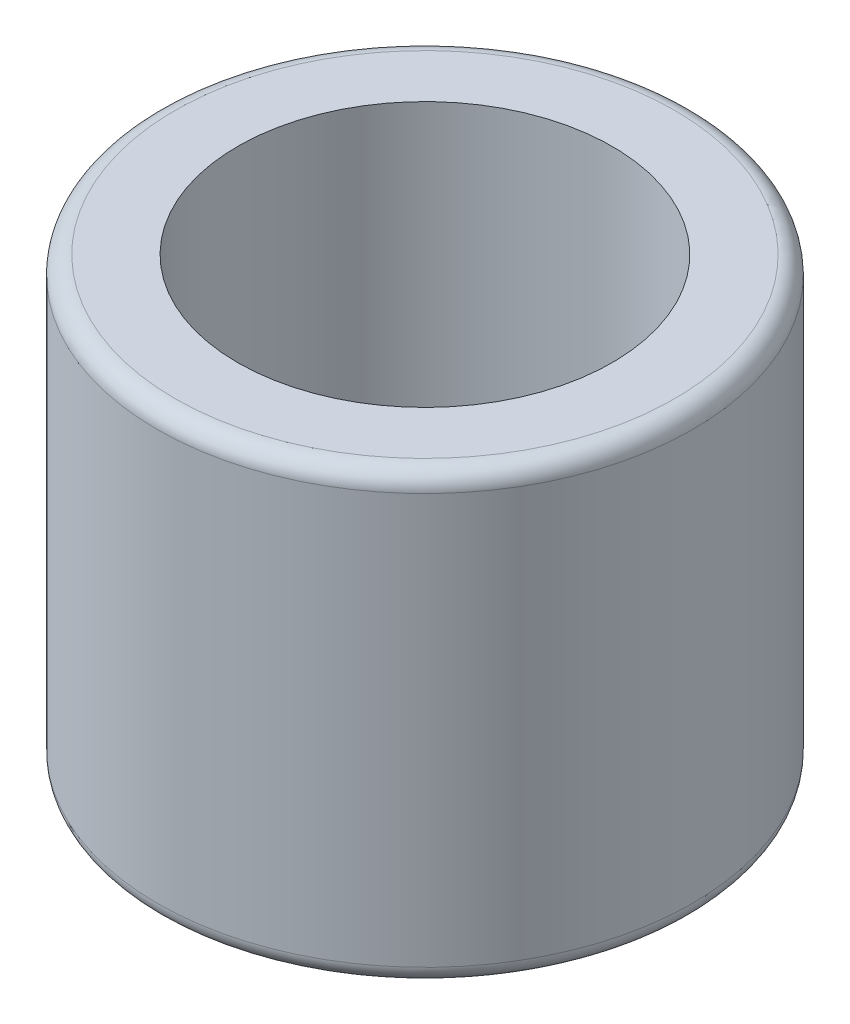
ISO-10303-21;
HEADER;
FILE_DESCRIPTION(('STEP AP214'),'2;1');
FILE_NAME('part.step','',(''),(''),'','','');
FILE_SCHEMA(('AUTOMOTIVE_DESIGN { 1 0 10303 214 1 1 1 1 }'));
ENDSEC;
DATA;
#1=APPLICATION_CONTEXT('core data for automotive mechanical design processes');
#2=APPLICATION_PROTOCOL_DEFINITION('international standard','automotive_design',2000,#1);
#3=PRODUCT_CONTEXT('',#1,'mechanical');
#4=PRODUCT('Part','Part','',(#3));
#5=PRODUCT_RELATED_PRODUCT_CATEGORY('part','',(#4));
#6=PRODUCT_DEFINITION_FORMATION('','',#4);
#7=PRODUCT_DEFINITION_CONTEXT('part definition',#1,'design');
#8=PRODUCT_DEFINITION('design','',#6,#7);
#9=PRODUCT_DEFINITION_SHAPE('','',#8);
#10=(LENGTH_UNIT() NAMED_UNIT(*) SI_UNIT(.MILLI.,.METRE.));
#11=(NAMED_UNIT(*) PLANE_ANGLE_UNIT() SI_UNIT($,.RADIAN.));
#12=(NAMED_UNIT(*) SI_UNIT($,.STERADIAN.) SOLID_ANGLE_UNIT());
#13=UNCERTAINTY_MEASURE_WITH_UNIT(LENGTH_MEASURE(1.E-05),#10,'distance_accuracy_value','');
#14=(GEOMETRIC_REPRESENTATION_CONTEXT(3) GLOBAL_UNCERTAINTY_ASSIGNED_CONTEXT((#13)) GLOBAL_UNIT_ASSIGNED_CONTEXT((#10,
#11,#12)) REPRESENTATION_CONTEXT('',''));
#15=CARTESIAN_POINT('',(0.,0.,0.));
#16=DIRECTION('',(0.,0.,1.));
#17=DIRECTION('',(1.,0.,0.));
#18=AXIS2_PLACEMENT_3D('',#15,#16,#17);
#19=CARTESIAN_POINT('',(0.,6.35,0.));
#20=DIRECTION('',(0.,1.,0.));
#21=DIRECTION('',(0.,0.,1.));
#22=AXIS2_PLACEMENT_3D('',#19,#20,#21);
#23=PLANE('',#22);
#24=CARTESIAN_POINT('',(0.,6.35,0.));
#25=DIRECTION('',(0.,1.,0.));
#26=DIRECTION('',(0.,0.,1.));
#27=AXIS2_PLACEMENT_3D('',#24,#25,#26);
#28=CIRCLE('',#27,3.556);
#29=CARTESIAN_POINT('',(0.,6.35,3.556));
#30=VERTEX_POINT('',#29);
#31=EDGE_CURVE('E10',#30,#30,#28,.T.);
#32=ORIENTED_EDGE('',*,*,#31,.T.);
#33=EDGE_LOOP('',(#32));
#34=FACE_BOUND('',#33,.T.);
#35=CARTESIAN_POINT('',(0.,6.35,0.));
#36=DIRECTION('',(0.,1.,0.));
#37=DIRECTION('',(0.,0.,1.));
#38=AXIS2_PLACEMENT_3D('',#35,#36,#37);
#39=CIRCLE('',#38,2.667);
#40=CARTESIAN_POINT('',(0.,6.35,2.667));
#41=VERTEX_POINT('',#40);
#42=EDGE_CURVE('E65',#41,#41,#39,.T.);
#43=ORIENTED_EDGE('',*,*,#42,.F.);
#44=EDGE_LOOP('',(#43));
#45=FACE_BOUND('',#44,.T.);
#46=ADVANCED_FACE('F41',(#34,#45),#23,.T.);
#47=CARTESIAN_POINT('',(0.,0.,0.));
#48=DIRECTION('',(0.,1.,0.));
#49=DIRECTION('',(0.,0.,1.));
#50=AXIS2_PLACEMENT_3D('',#47,#48,#49);
#51=PLANE('',#50);
#52=CARTESIAN_POINT('',(0.,0.,0.));
#53=DIRECTION('',(0.,1.,0.));
#54=DIRECTION('',(0.,0.,1.));
#55=AXIS2_PLACEMENT_3D('',#52,#53,#54);
#56=CIRCLE('',#55,3.556);
#57=CARTESIAN_POINT('',(0.,0.,3.556));
#58=VERTEX_POINT('',#57);
#59=EDGE_CURVE('E49',#58,#58,#56,.F.);
#60=ORIENTED_EDGE('',*,*,#59,.T.);
#61=EDGE_LOOP('',(#60));
#62=FACE_BOUND('',#61,.T.);
#63=CARTESIAN_POINT('',(0.,0.,0.));
#64=DIRECTION('',(0.,1.,0.));
#65=DIRECTION('',(0.,0.,1.));
#66=AXIS2_PLACEMENT_3D('',#63,#64,#65);
#67=CIRCLE('',#66,2.667);
#68=CARTESIAN_POINT('',(0.,0.,2.667));
#69=VERTEX_POINT('',#68);
#70=EDGE_CURVE('E66',#69,#69,#67,.T.);
#71=ORIENTED_EDGE('',*,*,#70,.T.);
#72=EDGE_LOOP('',(#71));
#73=FACE_BOUND('',#72,.T.);
#74=ADVANCED_FACE('F78',(#62,#73),#51,.F.);
#75=CARTESIAN_POINT('',(0.,6.35,0.));
#76=DIRECTION('',(0.,-1.,0.));
#77=DIRECTION('',(0.,0.,-1.));
#78=AXIS2_PLACEMENT_3D('',#75,#76,#77);
#79=CYLINDRICAL_SURFACE('',#78,3.81);
#80=CARTESIAN_POINT('',(0.,0.254,0.));
#81=DIRECTION('',(0.,1.,0.));
#82=DIRECTION('',(0.,0.,1.));
#83=AXIS2_PLACEMENT_3D('',#80,#81,#82);
#84=CIRCLE('',#83,3.81);
#85=CARTESIAN_POINT('',(0.,0.254,3.81));
#86=VERTEX_POINT('',#85);
#87=EDGE_CURVE('E54',#86,#86,#84,.T.);
#88=ORIENTED_EDGE('',*,*,#87,.T.);
#89=EDGE_LOOP('',(#88));
#90=FACE_BOUND('',#89,.T.);
#91=CARTESIAN_POINT('',(0.,6.096,0.));
#92=DIRECTION('',(0.,1.,0.));
#93=DIRECTION('',(0.,0.,1.));
#94=AXIS2_PLACEMENT_3D('',#91,#92,#93);
#95=CIRCLE('',#94,3.81);
#96=CARTESIAN_POINT('',(0.,6.096,3.81));
#97=VERTEX_POINT('',#96);
#98=EDGE_CURVE('E59',#97,#97,#95,.F.);
#99=ORIENTED_EDGE('',*,*,#98,.T.);
#100=EDGE_LOOP('',(#99));
#101=FACE_BOUND('',#100,.T.);
#102=ADVANCED_FACE('F83',(#90,#101),#79,.T.);
#103=CARTESIAN_POINT('',(0.,6.35,0.));
#104=DIRECTION('',(0.,-1.,0.));
#105=DIRECTION('',(0.,0.,-1.));
#106=AXIS2_PLACEMENT_3D('',#103,#104,#105);
#107=CYLINDRICAL_SURFACE('',#106,2.667);
#108=ORIENTED_EDGE('',*,*,#42,.T.);
#109=EDGE_LOOP('',(#108));
#110=FACE_BOUND('',#109,.T.);
#111=ORIENTED_EDGE('',*,*,#70,.F.);
#112=EDGE_LOOP('',(#111));
#113=FACE_BOUND('',#112,.T.);
#114=ADVANCED_FACE('F74',(#110,#113),#107,.F.);
#115=CARTESIAN_POINT('',(0.,0.254,0.));
#116=DIRECTION('',(0.,1.,0.));
#117=DIRECTION('',(0.,0.,1.));
#118=AXIS2_PLACEMENT_3D('',#115,#116,#117);
#119=TOROIDAL_SURFACE('',#118,3.556,0.254);
#120=ORIENTED_EDGE('',*,*,#59,.F.);
#121=EDGE_LOOP('',(#120));
#122=FACE_BOUND('',#121,.T.);
#123=ORIENTED_EDGE('',*,*,#87,.F.);
#124=EDGE_LOOP('',(#123));
#125=FACE_BOUND('',#124,.T.);
#126=ADVANCED_FACE('F89',(#122,#125),#119,.T.);
#127=CARTESIAN_POINT('',(0.,6.096,0.));
#128=DIRECTION('',(0.,1.,0.));
#129=DIRECTION('',(0.,0.,1.));
#130=AXIS2_PLACEMENT_3D('',#127,#128,#129);
#131=TOROIDAL_SURFACE('',#130,3.556,0.254);
#132=ORIENTED_EDGE('',*,*,#98,.F.);
#133=EDGE_LOOP('',(#132));
#134=FACE_BOUND('',#133,.T.);
#135=ORIENTED_EDGE('',*,*,#31,.F.);
#136=EDGE_LOOP('',(#135));
#137=FACE_BOUND('',#136,.T.);
#138=ADVANCED_FACE('F43',(#134,#137),#131,.T.);
#139=CLOSED_SHELL('',(#46,#74,#102,#114,#126,#138));
#140=MANIFOLD_SOLID_BREP('B2',#139);
#141=ADVANCED_BREP_SHAPE_REPRESENTATION('',(#18,#140),#14);
#142=SHAPE_DEFINITION_REPRESENTATION(#9,#141);
ENDSEC;
END-ISO-10303-21;
